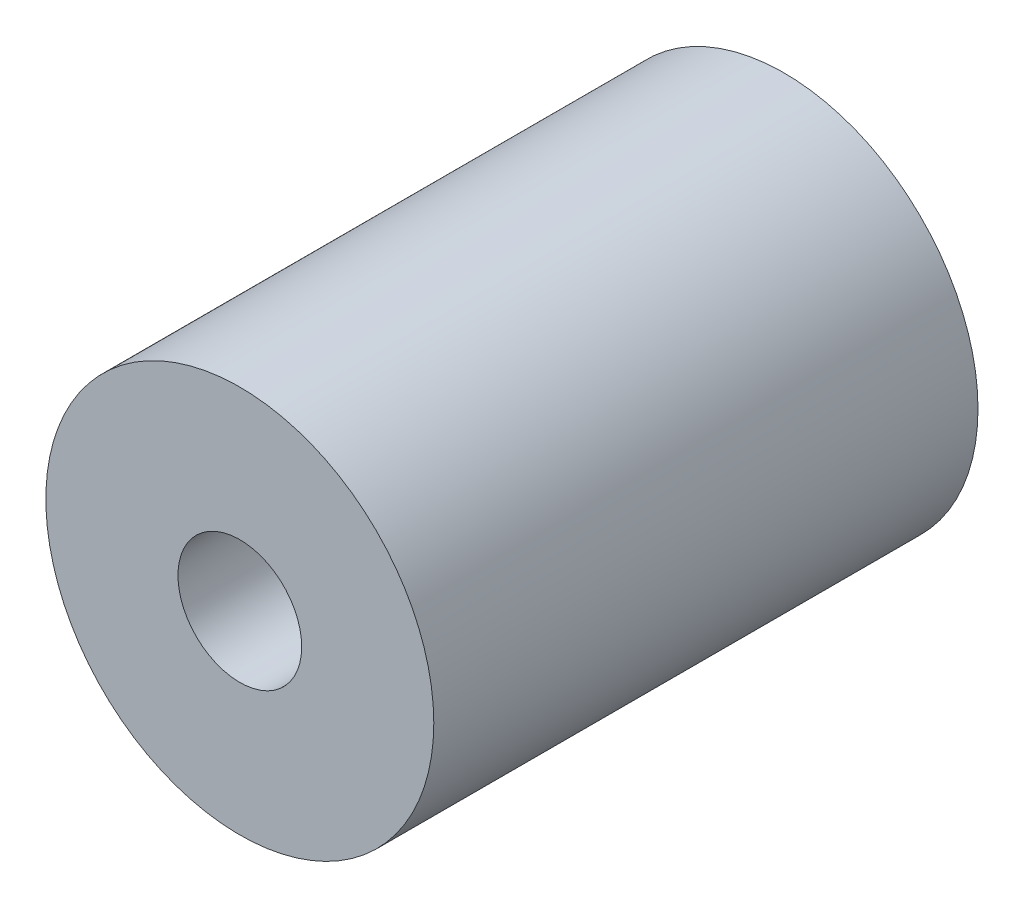
ISO-10303-21;
HEADER;
FILE_DESCRIPTION(('STEP AP214'),'2;1');
FILE_NAME('part.step','',(''),(''),'','','');
FILE_SCHEMA(('AUTOMOTIVE_DESIGN { 1 0 10303 214 1 1 1 1 }'));
ENDSEC;
DATA;
#1=APPLICATION_CONTEXT('core data for automotive mechanical design processes');
#2=APPLICATION_PROTOCOL_DEFINITION('international standard','automotive_design',2000,#1);
#3=PRODUCT_CONTEXT('',#1,'mechanical');
#4=PRODUCT('Part','Part','',(#3));
#5=PRODUCT_RELATED_PRODUCT_CATEGORY('part','',(#4));
#6=PRODUCT_DEFINITION_FORMATION('','',#4);
#7=PRODUCT_DEFINITION_CONTEXT('part definition',#1,'design');
#8=PRODUCT_DEFINITION('design','',#6,#7);
#9=PRODUCT_DEFINITION_SHAPE('','',#8);
#10=(LENGTH_UNIT() NAMED_UNIT(*) SI_UNIT(.MILLI.,.METRE.));
#11=(NAMED_UNIT(*) PLANE_ANGLE_UNIT() SI_UNIT($,.RADIAN.));
#12=(NAMED_UNIT(*) SI_UNIT($,.STERADIAN.) SOLID_ANGLE_UNIT());
#13=UNCERTAINTY_MEASURE_WITH_UNIT(LENGTH_MEASURE(1.E-05),#10,'distance_accuracy_value','');
#14=(GEOMETRIC_REPRESENTATION_CONTEXT(3) GLOBAL_UNCERTAINTY_ASSIGNED_CONTEXT((#13)) GLOBAL_UNIT_ASSIGNED_CONTEXT((#10,
#11,#12)) REPRESENTATION_CONTEXT('',''));
#15=CARTESIAN_POINT('',(0.,0.,0.));
#16=DIRECTION('',(0.,0.,1.));
#17=DIRECTION('',(1.,0.,0.));
#18=AXIS2_PLACEMENT_3D('',#15,#16,#17);
#19=CARTESIAN_POINT('',(0.005,0.,0.3));
#20=DIRECTION('',(0.,0.,1.));
#21=DIRECTION('',(-1.,0.,0.));
#22=AXIS2_PLACEMENT_3D('',#19,#20,#21);
#23=CYLINDRICAL_SURFACE('',#22,0.01136607748727);
#24=CARTESIAN_POINT('',(0.005,0.,0.4));
#25=DIRECTION('',(0.,0.,-1.));
#26=DIRECTION('',(-1.,0.,0.));
#27=AXIS2_PLACEMENT_3D('',#24,#25,#26);
#28=CIRCLE('',#27,0.01136607748727);
#29=CARTESIAN_POINT('',(0.01636607748727,0.,0.4));
#30=VERTEX_POINT('',#29);
#31=EDGE_CURVE('E56',#30,#30,#28,.T.);
#32=ORIENTED_EDGE('',*,*,#31,.F.);
#33=DIRECTION('',(0.,0.,-1.));
#34=VECTOR('',#33,1.);
#35=CARTESIAN_POINT('',(0.01636607748727,0.,0.3));
#36=LINE('',#35,#34);
#37=CARTESIAN_POINT('',(0.01636607748727,0.,0.3));
#38=VERTEX_POINT('',#37);
#39=EDGE_CURVE('E11',#30,#38,#36,.T.);
#40=ORIENTED_EDGE('',*,*,#39,.T.);
#41=CARTESIAN_POINT('',(0.005,0.,0.3));
#42=DIRECTION('',(0.,0.,-1.));
#43=DIRECTION('',(-1.,0.,0.));
#44=AXIS2_PLACEMENT_3D('',#41,#42,#43);
#45=CIRCLE('',#44,0.01136607748727);
#46=EDGE_CURVE('E55',#38,#38,#45,.T.);
#47=ORIENTED_EDGE('',*,*,#46,.T.);
#48=ORIENTED_EDGE('',*,*,#39,.F.);
#49=EDGE_LOOP('',(#32,#40,#47,#48));
#50=FACE_BOUND('',#49,.T.);
#51=ADVANCED_FACE('F17',(#50),#23,.F.);
#52=CARTESIAN_POINT('',(0.005,0.,0.3));
#53=DIRECTION('',(0.,0.,1.));
#54=DIRECTION('',(-1.,0.,0.));
#55=AXIS2_PLACEMENT_3D('',#52,#53,#54);
#56=CYLINDRICAL_SURFACE('',#55,0.03564348885832);
#57=CARTESIAN_POINT('',(0.005,0.,0.4));
#58=DIRECTION('',(0.,0.,1.));
#59=DIRECTION('',(-1.,0.,0.));
#60=AXIS2_PLACEMENT_3D('',#57,#58,#59);
#61=CIRCLE('',#60,0.03564348885832);
#62=CARTESIAN_POINT('',(0.04064348885832,0.,0.4));
#63=VERTEX_POINT('',#62);
#64=EDGE_CURVE('E59',#63,#63,#61,.T.);
#65=ORIENTED_EDGE('',*,*,#64,.F.);
#66=DIRECTION('',(0.,0.,-1.));
#67=VECTOR('',#66,1.);
#68=CARTESIAN_POINT('',(0.04064348885832,0.,0.3));
#69=LINE('',#68,#67);
#70=CARTESIAN_POINT('',(0.04064348885832,0.,0.3));
#71=VERTEX_POINT('',#70);
#72=EDGE_CURVE('E21',#63,#71,#69,.T.);
#73=ORIENTED_EDGE('',*,*,#72,.T.);
#74=CARTESIAN_POINT('',(0.005,0.,0.3));
#75=DIRECTION('',(0.,0.,1.));
#76=DIRECTION('',(-1.,0.,0.));
#77=AXIS2_PLACEMENT_3D('',#74,#75,#76);
#78=CIRCLE('',#77,0.03564348885832);
#79=EDGE_CURVE('E60',#71,#71,#78,.T.);
#80=ORIENTED_EDGE('',*,*,#79,.T.);
#81=ORIENTED_EDGE('',*,*,#72,.F.);
#82=EDGE_LOOP('',(#65,#73,#80,#81));
#83=FACE_BOUND('',#82,.T.);
#84=ADVANCED_FACE('F95',(#83),#56,.T.);
#85=CARTESIAN_POINT('',(0.005,0.,0.4));
#86=DIRECTION('',(0.,0.,1.));
#87=DIRECTION('',(1.,0.,0.));
#88=AXIS2_PLACEMENT_3D('',#85,#86,#87);
#89=PLANE('',#88);
#90=ORIENTED_EDGE('',*,*,#64,.T.);
#91=EDGE_LOOP('',(#90));
#92=FACE_BOUND('',#91,.T.);
#93=ORIENTED_EDGE('',*,*,#31,.T.);
#94=EDGE_LOOP('',(#93));
#95=FACE_BOUND('',#94,.T.);
#96=ADVANCED_FACE('F19',(#92,#95),#89,.T.);
#97=CARTESIAN_POINT('',(0.005,0.,0.3));
#98=DIRECTION('',(0.,0.,1.));
#99=DIRECTION('',(1.,0.,0.));
#100=AXIS2_PLACEMENT_3D('',#97,#98,#99);
#101=PLANE('',#100);
#102=ORIENTED_EDGE('',*,*,#79,.F.);
#103=EDGE_LOOP('',(#102));
#104=FACE_BOUND('',#103,.T.);
#105=ORIENTED_EDGE('',*,*,#46,.F.);
#106=EDGE_LOOP('',(#105));
#107=FACE_BOUND('',#106,.T.);
#108=ADVANCED_FACE('F107',(#104,#107),#101,.F.);
#109=CLOSED_SHELL('',(#51,#84,#96,#108));
#110=MANIFOLD_SOLID_BREP('B1',#109);
#111=ADVANCED_BREP_SHAPE_REPRESENTATION('',(#18,#110),#14);
#112=SHAPE_DEFINITION_REPRESENTATION(#9,#111);
ENDSEC;
END-ISO-10303-21;
